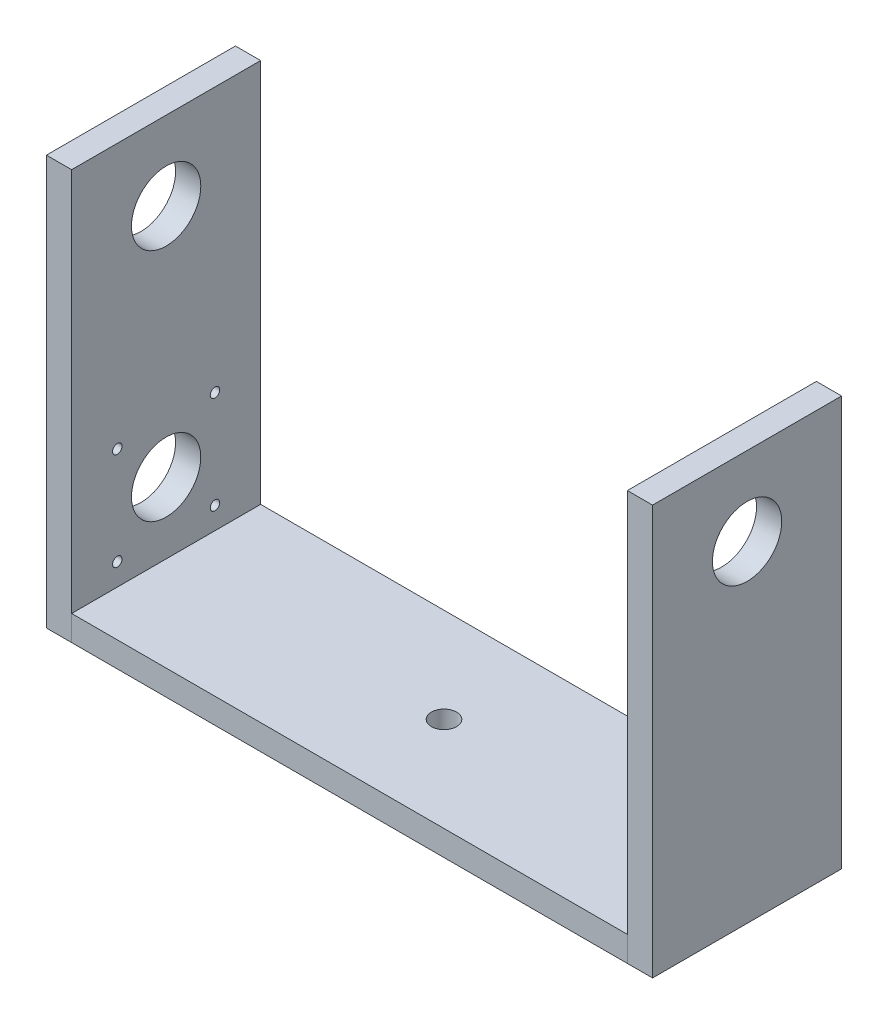
ISO-10303-21;
HEADER;
FILE_DESCRIPTION(('STEP AP214'),'2;1');
FILE_NAME('part.step','',(''),(''),'','','');
FILE_SCHEMA(('AUTOMOTIVE_DESIGN { 1 0 10303 214 1 1 1 1 }'));
ENDSEC;
DATA;
#1=APPLICATION_CONTEXT('core data for automotive mechanical design processes');
#2=APPLICATION_PROTOCOL_DEFINITION('international standard','automotive_design',2000,#1);
#3=PRODUCT_CONTEXT('',#1,'mechanical');
#4=PRODUCT('Part','Part','',(#3));
#5=PRODUCT_RELATED_PRODUCT_CATEGORY('part','',(#4));
#6=PRODUCT_DEFINITION_FORMATION('','',#4);
#7=PRODUCT_DEFINITION_CONTEXT('part definition',#1,'design');
#8=PRODUCT_DEFINITION('design','',#6,#7);
#9=PRODUCT_DEFINITION_SHAPE('','',#8);
#10=(LENGTH_UNIT() NAMED_UNIT(*) SI_UNIT(.MILLI.,.METRE.));
#11=(NAMED_UNIT(*) PLANE_ANGLE_UNIT() SI_UNIT($,.RADIAN.));
#12=(NAMED_UNIT(*) SI_UNIT($,.STERADIAN.) SOLID_ANGLE_UNIT());
#13=UNCERTAINTY_MEASURE_WITH_UNIT(LENGTH_MEASURE(1.E-05),#10,'distance_accuracy_value','');
#14=(GEOMETRIC_REPRESENTATION_CONTEXT(3) GLOBAL_UNCERTAINTY_ASSIGNED_CONTEXT((#13)) GLOBAL_UNIT_ASSIGNED_CONTEXT((#10,
#11,#12)) REPRESENTATION_CONTEXT('',''));
#15=CARTESIAN_POINT('',(0.,0.,0.));
#16=DIRECTION('',(0.,0.,1.));
#17=DIRECTION('',(1.,0.,0.));
#18=AXIS2_PLACEMENT_3D('',#15,#16,#17);
#19=CARTESIAN_POINT('',(-96.2,126.,60.));
#20=DIRECTION('',(0.,-1.,0.));
#21=DIRECTION('',(0.,0.,-1.));
#22=AXIS2_PLACEMENT_3D('',#19,#20,#21);
#23=PLANE('',#22);
#24=DIRECTION('',(0.,0.,-1.));
#25=VECTOR('',#24,1.);
#26=CARTESIAN_POINT('',(-88.2,126.,60.));
#27=LINE('',#26,#25);
#28=CARTESIAN_POINT('',(-88.2,126.,60.));
#29=VERTEX_POINT('',#28);
#30=CARTESIAN_POINT('',(-88.2,126.,0.));
#31=VERTEX_POINT('',#30);
#32=EDGE_CURVE('E109',#29,#31,#27,.T.);
#33=ORIENTED_EDGE('',*,*,#32,.T.);
#34=DIRECTION('',(1.,0.,0.));
#35=VECTOR('',#34,1.);
#36=CARTESIAN_POINT('',(-96.2,126.,0.));
#37=LINE('',#36,#35);
#38=CARTESIAN_POINT('',(-96.2,126.,0.));
#39=VERTEX_POINT('',#38);
#40=EDGE_CURVE('E12',#39,#31,#37,.T.);
#41=ORIENTED_EDGE('',*,*,#40,.F.);
#42=DIRECTION('',(0.,0.,-1.));
#43=VECTOR('',#42,1.);
#44=CARTESIAN_POINT('',(-96.2,126.,60.));
#45=LINE('',#44,#43);
#46=CARTESIAN_POINT('',(-96.2,126.,60.));
#47=VERTEX_POINT('',#46);
#48=EDGE_CURVE('E96',#47,#39,#45,.T.);
#49=ORIENTED_EDGE('',*,*,#48,.F.);
#50=DIRECTION('',(1.,0.,0.));
#51=VECTOR('',#50,1.);
#52=CARTESIAN_POINT('',(-96.2,126.,60.));
#53=LINE('',#52,#51);
#54=EDGE_CURVE('E105',#47,#29,#53,.T.);
#55=ORIENTED_EDGE('',*,*,#54,.T.);
#56=EDGE_LOOP('',(#33,#41,#49,#55));
#57=FACE_BOUND('',#56,.T.);
#58=ADVANCED_FACE('F44',(#57),#23,.F.);
#59=CARTESIAN_POINT('',(-96.2,126.,0.));
#60=DIRECTION('',(0.,0.,1.));
#61=DIRECTION('',(1.,0.,0.));
#62=AXIS2_PLACEMENT_3D('',#59,#60,#61);
#63=PLANE('',#62);
#64=DIRECTION('',(0.,-1.,0.));
#65=VECTOR('',#64,1.);
#66=CARTESIAN_POINT('',(-88.2,126.,0.));
#67=LINE('',#66,#65);
#68=CARTESIAN_POINT('',(-88.2,-4.,0.));
#69=VERTEX_POINT('',#68);
#70=EDGE_CURVE('E100',#31,#69,#67,.T.);
#71=ORIENTED_EDGE('',*,*,#70,.T.);
#72=DIRECTION('',(1.,0.,0.));
#73=VECTOR('',#72,1.);
#74=CARTESIAN_POINT('',(-96.2,-4.,0.));
#75=LINE('',#74,#73);
#76=CARTESIAN_POINT('',(-96.2,-4.,0.));
#77=VERTEX_POINT('',#76);
#78=EDGE_CURVE('E53',#77,#69,#75,.T.);
#79=ORIENTED_EDGE('',*,*,#78,.F.);
#80=DIRECTION('',(0.,-1.,0.));
#81=VECTOR('',#80,1.);
#82=CARTESIAN_POINT('',(-96.2,126.,0.));
#83=LINE('',#82,#81);
#84=EDGE_CURVE('E91',#39,#77,#83,.T.);
#85=ORIENTED_EDGE('',*,*,#84,.F.);
#86=ORIENTED_EDGE('',*,*,#40,.T.);
#87=EDGE_LOOP('',(#71,#79,#85,#86));
#88=FACE_BOUND('',#87,.T.);
#89=ADVANCED_FACE('F99',(#88),#63,.F.);
#90=CARTESIAN_POINT('',(-96.2,-4.,0.));
#91=DIRECTION('',(0.,1.,0.));
#92=DIRECTION('',(0.,0.,1.));
#93=AXIS2_PLACEMENT_3D('',#90,#91,#92);
#94=PLANE('',#93);
#95=DIRECTION('',(0.,0.,1.));
#96=VECTOR('',#95,1.);
#97=CARTESIAN_POINT('',(-88.2,-4.,0.));
#98=LINE('',#97,#96);
#99=CARTESIAN_POINT('',(-88.2,-4.,60.));
#100=VERTEX_POINT('',#99);
#101=EDGE_CURVE('E78',#69,#100,#98,.T.);
#102=ORIENTED_EDGE('',*,*,#101,.T.);
#103=DIRECTION('',(1.,0.,0.));
#104=VECTOR('',#103,1.);
#105=CARTESIAN_POINT('',(-96.2,-4.,60.));
#106=LINE('',#105,#104);
#107=CARTESIAN_POINT('',(-96.2,-4.,60.));
#108=VERTEX_POINT('',#107);
#109=EDGE_CURVE('E101',#108,#100,#106,.T.);
#110=ORIENTED_EDGE('',*,*,#109,.F.);
#111=DIRECTION('',(0.,0.,1.));
#112=VECTOR('',#111,1.);
#113=CARTESIAN_POINT('',(-96.2,-4.,0.));
#114=LINE('',#113,#112);
#115=EDGE_CURVE('E94',#77,#108,#114,.T.);
#116=ORIENTED_EDGE('',*,*,#115,.F.);
#117=ORIENTED_EDGE('',*,*,#78,.T.);
#118=EDGE_LOOP('',(#102,#110,#116,#117));
#119=FACE_BOUND('',#118,.T.);
#120=ADVANCED_FACE('F103',(#119),#94,.F.);
#121=CARTESIAN_POINT('',(-96.2,-4.,60.));
#122=DIRECTION('',(0.,0.,-1.));
#123=DIRECTION('',(-1.,0.,0.));
#124=AXIS2_PLACEMENT_3D('',#121,#122,#123);
#125=PLANE('',#124);
#126=DIRECTION('',(0.,1.,0.));
#127=VECTOR('',#126,1.);
#128=CARTESIAN_POINT('',(-88.2,-4.,60.));
#129=LINE('',#128,#127);
#130=EDGE_CURVE('E84',#100,#29,#129,.T.);
#131=ORIENTED_EDGE('',*,*,#130,.T.);
#132=ORIENTED_EDGE('',*,*,#54,.F.);
#133=DIRECTION('',(0.,1.,0.));
#134=VECTOR('',#133,1.);
#135=CARTESIAN_POINT('',(-96.2,-4.,60.));
#136=LINE('',#135,#134);
#137=EDGE_CURVE('E61',#108,#47,#136,.T.);
#138=ORIENTED_EDGE('',*,*,#137,.F.);
#139=ORIENTED_EDGE('',*,*,#109,.T.);
#140=EDGE_LOOP('',(#131,#132,#138,#139));
#141=FACE_BOUND('',#140,.T.);
#142=ADVANCED_FACE('F116',(#141),#125,.F.);
#143=CARTESIAN_POINT('',(-96.2,0.,0.));
#144=DIRECTION('',(-1.,0.,0.));
#145=DIRECTION('',(0.,0.,1.));
#146=AXIS2_PLACEMENT_3D('',#143,#144,#145);
#147=PLANE('',#146);
#148=CARTESIAN_POINT('',(-96.2,26.5,30.));
#149=DIRECTION('',(-1.,0.,0.));
#150=DIRECTION('',(0.,0.,1.));
#151=AXIS2_PLACEMENT_3D('',#148,#149,#150);
#152=CIRCLE('',#151,11.);
#153=CARTESIAN_POINT('',(-96.2,26.5,41.));
#154=VERTEX_POINT('',#153);
#155=EDGE_CURVE('E136',#154,#154,#152,.T.);
#156=ORIENTED_EDGE('',*,*,#155,.F.);
#157=EDGE_LOOP('',(#156));
#158=FACE_BOUND('',#157,.T.);
#159=CARTESIAN_POINT('',(-96.2,11.,14.5));
#160=DIRECTION('',(-1.,0.,0.));
#161=DIRECTION('',(0.,0.,1.));
#162=AXIS2_PLACEMENT_3D('',#159,#160,#161);
#163=CIRCLE('',#162,1.5);
#164=CARTESIAN_POINT('',(-96.2,11.,16.));
#165=VERTEX_POINT('',#164);
#166=EDGE_CURVE('E135',#165,#165,#163,.T.);
#167=ORIENTED_EDGE('',*,*,#166,.F.);
#168=EDGE_LOOP('',(#167));
#169=FACE_BOUND('',#168,.T.);
#170=CARTESIAN_POINT('',(-96.2,11.,45.5));
#171=DIRECTION('',(-1.,0.,0.));
#172=DIRECTION('',(0.,0.,1.));
#173=AXIS2_PLACEMENT_3D('',#170,#171,#172);
#174=CIRCLE('',#173,1.5);
#175=CARTESIAN_POINT('',(-96.2,11.,47.));
#176=VERTEX_POINT('',#175);
#177=EDGE_CURVE('E142',#176,#176,#174,.T.);
#178=ORIENTED_EDGE('',*,*,#177,.F.);
#179=EDGE_LOOP('',(#178));
#180=FACE_BOUND('',#179,.T.);
#181=CARTESIAN_POINT('',(-96.2,42.,45.5));
#182=DIRECTION('',(-1.,0.,0.));
#183=DIRECTION('',(0.,0.,1.));
#184=AXIS2_PLACEMENT_3D('',#181,#182,#183);
#185=CIRCLE('',#184,1.5);
#186=CARTESIAN_POINT('',(-96.2,42.,47.));
#187=VERTEX_POINT('',#186);
#188=EDGE_CURVE('E148',#187,#187,#185,.T.);
#189=ORIENTED_EDGE('',*,*,#188,.F.);
#190=EDGE_LOOP('',(#189));
#191=FACE_BOUND('',#190,.T.);
#192=CARTESIAN_POINT('',(-96.2,42.,14.5));
#193=DIRECTION('',(-1.,0.,0.));
#194=DIRECTION('',(0.,0.,1.));
#195=AXIS2_PLACEMENT_3D('',#192,#193,#194);
#196=CIRCLE('',#195,1.5);
#197=CARTESIAN_POINT('',(-96.2,42.,16.));
#198=VERTEX_POINT('',#197);
#199=EDGE_CURVE('E128',#198,#198,#196,.T.);
#200=ORIENTED_EDGE('',*,*,#199,.F.);
#201=EDGE_LOOP('',(#200));
#202=FACE_BOUND('',#201,.T.);
#203=CARTESIAN_POINT('',(-96.2,101.,30.));
#204=DIRECTION('',(1.,0.,0.));
#205=DIRECTION('',(0.,0.,-1.));
#206=AXIS2_PLACEMENT_3D('',#203,#204,#205);
#207=CIRCLE('',#206,11.);
#208=CARTESIAN_POINT('',(-96.2,101.,19.));
#209=VERTEX_POINT('',#208);
#210=EDGE_CURVE('E122',#209,#209,#207,.T.);
#211=ORIENTED_EDGE('',*,*,#210,.T.);
#212=EDGE_LOOP('',(#211));
#213=FACE_BOUND('',#212,.T.);
#214=ORIENTED_EDGE('',*,*,#48,.T.);
#215=ORIENTED_EDGE('',*,*,#84,.T.);
#216=ORIENTED_EDGE('',*,*,#115,.T.);
#217=ORIENTED_EDGE('',*,*,#137,.T.);
#218=EDGE_LOOP('',(#214,#215,#216,#217));
#219=FACE_BOUND('',#218,.T.);
#220=ADVANCED_FACE('F92',(#158,#169,#180,#191,#202,#213,#219),#147,.T.);
#221=CARTESIAN_POINT('',(-88.2,0.,0.));
#222=DIRECTION('',(-1.,0.,0.));
#223=DIRECTION('',(0.,0.,1.));
#224=AXIS2_PLACEMENT_3D('',#221,#222,#223);
#225=PLANE('',#224);
#226=CARTESIAN_POINT('',(-88.2,26.5,30.));
#227=DIRECTION('',(-1.,0.,0.));
#228=DIRECTION('',(0.,0.,1.));
#229=AXIS2_PLACEMENT_3D('',#226,#227,#228);
#230=CIRCLE('',#229,11.);
#231=CARTESIAN_POINT('',(-88.2,26.5,41.));
#232=VERTEX_POINT('',#231);
#233=EDGE_CURVE('E132',#232,#232,#230,.F.);
#234=ORIENTED_EDGE('',*,*,#233,.F.);
#235=EDGE_LOOP('',(#234));
#236=FACE_BOUND('',#235,.T.);
#237=CARTESIAN_POINT('',(-88.2,11.,14.5));
#238=DIRECTION('',(-1.,0.,0.));
#239=DIRECTION('',(0.,0.,1.));
#240=AXIS2_PLACEMENT_3D('',#237,#238,#239);
#241=CIRCLE('',#240,1.5);
#242=CARTESIAN_POINT('',(-88.2,11.,16.));
#243=VERTEX_POINT('',#242);
#244=EDGE_CURVE('E139',#243,#243,#241,.F.);
#245=ORIENTED_EDGE('',*,*,#244,.F.);
#246=EDGE_LOOP('',(#245));
#247=FACE_BOUND('',#246,.T.);
#248=CARTESIAN_POINT('',(-88.2,11.,45.5));
#249=DIRECTION('',(-1.,0.,0.));
#250=DIRECTION('',(0.,0.,1.));
#251=AXIS2_PLACEMENT_3D('',#248,#249,#250);
#252=CIRCLE('',#251,1.5);
#253=CARTESIAN_POINT('',(-88.2,11.,47.));
#254=VERTEX_POINT('',#253);
#255=EDGE_CURVE('E145',#254,#254,#252,.F.);
#256=ORIENTED_EDGE('',*,*,#255,.F.);
#257=EDGE_LOOP('',(#256));
#258=FACE_BOUND('',#257,.T.);
#259=CARTESIAN_POINT('',(-88.2,42.,45.5));
#260=DIRECTION('',(-1.,0.,0.));
#261=DIRECTION('',(0.,0.,1.));
#262=AXIS2_PLACEMENT_3D('',#259,#260,#261);
#263=CIRCLE('',#262,1.5);
#264=CARTESIAN_POINT('',(-88.2,42.,47.));
#265=VERTEX_POINT('',#264);
#266=EDGE_CURVE('E131',#265,#265,#263,.F.);
#267=ORIENTED_EDGE('',*,*,#266,.F.);
#268=EDGE_LOOP('',(#267));
#269=FACE_BOUND('',#268,.T.);
#270=CARTESIAN_POINT('',(-88.2,42.,14.5));
#271=DIRECTION('',(-1.,0.,0.));
#272=DIRECTION('',(0.,0.,1.));
#273=AXIS2_PLACEMENT_3D('',#270,#271,#272);
#274=CIRCLE('',#273,1.5);
#275=CARTESIAN_POINT('',(-88.2,42.,16.));
#276=VERTEX_POINT('',#275);
#277=EDGE_CURVE('E125',#276,#276,#274,.F.);
#278=ORIENTED_EDGE('',*,*,#277,.F.);
#279=EDGE_LOOP('',(#278));
#280=FACE_BOUND('',#279,.T.);
#281=CARTESIAN_POINT('',(-88.2,101.,30.));
#282=DIRECTION('',(-1.,0.,0.));
#283=DIRECTION('',(0.,0.,1.));
#284=AXIS2_PLACEMENT_3D('',#281,#282,#283);
#285=CIRCLE('',#284,11.);
#286=CARTESIAN_POINT('',(-88.2,101.,41.));
#287=VERTEX_POINT('',#286);
#288=EDGE_CURVE('E47',#287,#287,#285,.T.);
#289=ORIENTED_EDGE('',*,*,#288,.T.);
#290=EDGE_LOOP('',(#289));
#291=FACE_BOUND('',#290,.T.);
#292=ORIENTED_EDGE('',*,*,#32,.F.);
#293=ORIENTED_EDGE('',*,*,#130,.F.);
#294=ORIENTED_EDGE('',*,*,#101,.F.);
#295=ORIENTED_EDGE('',*,*,#70,.F.);
#296=EDGE_LOOP('',(#292,#293,#294,#295));
#297=FACE_BOUND('',#296,.T.);
#298=ADVANCED_FACE('F119',(#236,#247,#258,#269,#280,#291,#297),#225,.F.);
#299=CARTESIAN_POINT('',(-96.2,101.,30.));
#300=DIRECTION('',(1.,0.,0.));
#301=DIRECTION('',(0.,0.,-1.));
#302=AXIS2_PLACEMENT_3D('',#299,#300,#301);
#303=CYLINDRICAL_SURFACE('',#302,11.);
#304=ORIENTED_EDGE('',*,*,#210,.F.);
#305=EDGE_LOOP('',(#304));
#306=FACE_BOUND('',#305,.T.);
#307=ORIENTED_EDGE('',*,*,#288,.F.);
#308=EDGE_LOOP('',(#307));
#309=FACE_BOUND('',#308,.T.);
#310=ADVANCED_FACE('F167',(#306,#309),#303,.F.);
#311=CARTESIAN_POINT('',(96.201,42.,14.5));
#312=DIRECTION('',(-1.,0.,0.));
#313=DIRECTION('',(0.,0.,1.));
#314=AXIS2_PLACEMENT_3D('',#311,#312,#313);
#315=CYLINDRICAL_SURFACE('',#314,1.5);
#316=ORIENTED_EDGE('',*,*,#199,.T.);
#317=EDGE_LOOP('',(#316));
#318=FACE_BOUND('',#317,.T.);
#319=ORIENTED_EDGE('',*,*,#277,.T.);
#320=EDGE_LOOP('',(#319));
#321=FACE_BOUND('',#320,.T.);
#322=ADVANCED_FACE('F170',(#318,#321),#315,.F.);
#323=CARTESIAN_POINT('',(96.201,42.,45.5));
#324=DIRECTION('',(-1.,0.,0.));
#325=DIRECTION('',(0.,0.,1.));
#326=AXIS2_PLACEMENT_3D('',#323,#324,#325);
#327=CYLINDRICAL_SURFACE('',#326,1.5);
#328=ORIENTED_EDGE('',*,*,#188,.T.);
#329=EDGE_LOOP('',(#328));
#330=FACE_BOUND('',#329,.T.);
#331=ORIENTED_EDGE('',*,*,#266,.T.);
#332=EDGE_LOOP('',(#331));
#333=FACE_BOUND('',#332,.T.);
#334=ADVANCED_FACE('F156',(#330,#333),#327,.F.);
#335=CARTESIAN_POINT('',(96.201,11.,45.5));
#336=DIRECTION('',(-1.,0.,0.));
#337=DIRECTION('',(0.,0.,1.));
#338=AXIS2_PLACEMENT_3D('',#335,#336,#337);
#339=CYLINDRICAL_SURFACE('',#338,1.5);
#340=ORIENTED_EDGE('',*,*,#177,.T.);
#341=EDGE_LOOP('',(#340));
#342=FACE_BOUND('',#341,.T.);
#343=ORIENTED_EDGE('',*,*,#255,.T.);
#344=EDGE_LOOP('',(#343));
#345=FACE_BOUND('',#344,.T.);
#346=ADVANCED_FACE('F223',(#342,#345),#339,.F.);
#347=CARTESIAN_POINT('',(96.201,11.,14.5));
#348=DIRECTION('',(-1.,0.,0.));
#349=DIRECTION('',(0.,0.,1.));
#350=AXIS2_PLACEMENT_3D('',#347,#348,#349);
#351=CYLINDRICAL_SURFACE('',#350,1.5);
#352=ORIENTED_EDGE('',*,*,#166,.T.);
#353=EDGE_LOOP('',(#352));
#354=FACE_BOUND('',#353,.T.);
#355=ORIENTED_EDGE('',*,*,#244,.T.);
#356=EDGE_LOOP('',(#355));
#357=FACE_BOUND('',#356,.T.);
#358=ADVANCED_FACE('F230',(#354,#357),#351,.F.);
#359=CARTESIAN_POINT('',(96.201,26.5,30.));
#360=DIRECTION('',(-1.,0.,0.));
#361=DIRECTION('',(0.,0.,1.));
#362=AXIS2_PLACEMENT_3D('',#359,#360,#361);
#363=CYLINDRICAL_SURFACE('',#362,11.);
#364=ORIENTED_EDGE('',*,*,#155,.T.);
#365=EDGE_LOOP('',(#364));
#366=FACE_BOUND('',#365,.T.);
#367=ORIENTED_EDGE('',*,*,#233,.T.);
#368=EDGE_LOOP('',(#367));
#369=FACE_BOUND('',#368,.T.);
#370=ADVANCED_FACE('F238',(#366,#369),#363,.F.);
#371=CLOSED_SHELL('',(#58,#89,#120,#142,#220,#298,#310,#322,#334,#346,#358,#370));
#372=MANIFOLD_SOLID_BREP('B2',#371);
#373=CARTESIAN_POINT('',(96.2,-4.,60.));
#374=DIRECTION('',(0.,0.,-1.));
#375=DIRECTION('',(-1.,0.,0.));
#376=AXIS2_PLACEMENT_3D('',#373,#374,#375);
#377=PLANE('',#376);
#378=DIRECTION('',(0.,-1.,0.));
#379=VECTOR('',#378,1.);
#380=CARTESIAN_POINT('',(88.2,-4.,60.));
#381=LINE('',#380,#379);
#382=CARTESIAN_POINT('',(88.2,126.,60.));
#383=VERTEX_POINT('',#382);
#384=CARTESIAN_POINT('',(88.2,-4.,60.));
#385=VERTEX_POINT('',#384);
#386=EDGE_CURVE('E367',#383,#385,#381,.T.);
#387=ORIENTED_EDGE('',*,*,#386,.T.);
#388=DIRECTION('',(-1.,0.,0.));
#389=VECTOR('',#388,1.);
#390=CARTESIAN_POINT('',(96.2,-4.,60.));
#391=LINE('',#390,#389);
#392=CARTESIAN_POINT('',(96.2,-4.,60.));
#393=VERTEX_POINT('',#392);
#394=EDGE_CURVE('E42',#393,#385,#391,.T.);
#395=ORIENTED_EDGE('',*,*,#394,.F.);
#396=DIRECTION('',(0.,-1.,0.));
#397=VECTOR('',#396,1.);
#398=CARTESIAN_POINT('',(96.2,-4.,60.));
#399=LINE('',#398,#397);
#400=CARTESIAN_POINT('',(96.2,126.,60.));
#401=VERTEX_POINT('',#400);
#402=EDGE_CURVE('E354',#401,#393,#399,.T.);
#403=ORIENTED_EDGE('',*,*,#402,.F.);
#404=DIRECTION('',(-1.,0.,0.));
#405=VECTOR('',#404,1.);
#406=CARTESIAN_POINT('',(96.2,126.,60.));
#407=LINE('',#406,#405);
#408=EDGE_CURVE('E363',#401,#383,#407,.T.);
#409=ORIENTED_EDGE('',*,*,#408,.T.);
#410=EDGE_LOOP('',(#387,#395,#403,#409));
#411=FACE_BOUND('',#410,.T.);
#412=ADVANCED_FACE('F302',(#411),#377,.F.);
#413=CARTESIAN_POINT('',(96.2,-4.,60.));
#414=DIRECTION('',(0.,1.,0.));
#415=DIRECTION('',(0.,0.,1.));
#416=AXIS2_PLACEMENT_3D('',#413,#414,#415);
#417=PLANE('',#416);
#418=DIRECTION('',(0.,0.,-1.));
#419=VECTOR('',#418,1.);
#420=CARTESIAN_POINT('',(88.2,-4.,60.));
#421=LINE('',#420,#419);
#422=CARTESIAN_POINT('',(88.2,-4.,0.));
#423=VERTEX_POINT('',#422);
#424=EDGE_CURVE('E358',#385,#423,#421,.T.);
#425=ORIENTED_EDGE('',*,*,#424,.T.);
#426=DIRECTION('',(-1.,0.,0.));
#427=VECTOR('',#426,1.);
#428=CARTESIAN_POINT('',(96.2,-4.,0.));
#429=LINE('',#428,#427);
#430=CARTESIAN_POINT('',(96.2,-4.,0.));
#431=VERTEX_POINT('',#430);
#432=EDGE_CURVE('E311',#431,#423,#429,.T.);
#433=ORIENTED_EDGE('',*,*,#432,.F.);
#434=DIRECTION('',(0.,0.,-1.));
#435=VECTOR('',#434,1.);
#436=CARTESIAN_POINT('',(96.2,-4.,60.));
#437=LINE('',#436,#435);
#438=EDGE_CURVE('E349',#393,#431,#437,.T.);
#439=ORIENTED_EDGE('',*,*,#438,.F.);
#440=ORIENTED_EDGE('',*,*,#394,.T.);
#441=EDGE_LOOP('',(#425,#433,#439,#440));
#442=FACE_BOUND('',#441,.T.);
#443=ADVANCED_FACE('F357',(#442),#417,.F.);
#444=CARTESIAN_POINT('',(96.2,-4.,0.));
#445=DIRECTION('',(0.,0.,1.));
#446=DIRECTION('',(1.,0.,0.));
#447=AXIS2_PLACEMENT_3D('',#444,#445,#446);
#448=PLANE('',#447);
#449=DIRECTION('',(0.,1.,0.));
#450=VECTOR('',#449,1.);
#451=CARTESIAN_POINT('',(88.2,-4.,0.));
#452=LINE('',#451,#450);
#453=CARTESIAN_POINT('',(88.2,126.,0.));
#454=VERTEX_POINT('',#453);
#455=EDGE_CURVE('E336',#423,#454,#452,.T.);
#456=ORIENTED_EDGE('',*,*,#455,.T.);
#457=DIRECTION('',(-1.,0.,0.));
#458=VECTOR('',#457,1.);
#459=CARTESIAN_POINT('',(96.2,126.,0.));
#460=LINE('',#459,#458);
#461=CARTESIAN_POINT('',(96.2,126.,0.));
#462=VERTEX_POINT('',#461);
#463=EDGE_CURVE('E359',#462,#454,#460,.T.);
#464=ORIENTED_EDGE('',*,*,#463,.F.);
#465=DIRECTION('',(0.,1.,0.));
#466=VECTOR('',#465,1.);
#467=CARTESIAN_POINT('',(96.2,-4.,0.));
#468=LINE('',#467,#466);
#469=EDGE_CURVE('E352',#431,#462,#468,.T.);
#470=ORIENTED_EDGE('',*,*,#469,.F.);
#471=ORIENTED_EDGE('',*,*,#432,.T.);
#472=EDGE_LOOP('',(#456,#464,#470,#471));
#473=FACE_BOUND('',#472,.T.);
#474=ADVANCED_FACE('F361',(#473),#448,.F.);
#475=CARTESIAN_POINT('',(96.2,126.,60.));
#476=DIRECTION('',(0.,-1.,0.));
#477=DIRECTION('',(0.,0.,-1.));
#478=AXIS2_PLACEMENT_3D('',#475,#476,#477);
#479=PLANE('',#478);
#480=DIRECTION('',(0.,0.,1.));
#481=VECTOR('',#480,1.);
#482=CARTESIAN_POINT('',(88.2,126.,60.));
#483=LINE('',#482,#481);
#484=EDGE_CURVE('E342',#454,#383,#483,.T.);
#485=ORIENTED_EDGE('',*,*,#484,.T.);
#486=ORIENTED_EDGE('',*,*,#408,.F.);
#487=DIRECTION('',(0.,0.,1.));
#488=VECTOR('',#487,1.);
#489=CARTESIAN_POINT('',(96.2,126.,60.));
#490=LINE('',#489,#488);
#491=EDGE_CURVE('E319',#462,#401,#490,.T.);
#492=ORIENTED_EDGE('',*,*,#491,.F.);
#493=ORIENTED_EDGE('',*,*,#463,.T.);
#494=EDGE_LOOP('',(#485,#486,#492,#493));
#495=FACE_BOUND('',#494,.T.);
#496=ADVANCED_FACE('F374',(#495),#479,.F.);
#497=CARTESIAN_POINT('',(96.2,0.,0.));
#498=DIRECTION('',(-1.,0.,0.));
#499=DIRECTION('',(0.,0.,1.));
#500=AXIS2_PLACEMENT_3D('',#497,#498,#499);
#501=PLANE('',#500);
#502=CARTESIAN_POINT('',(96.2,101.,30.));
#503=DIRECTION('',(1.,0.,0.));
#504=DIRECTION('',(0.,0.,-1.));
#505=AXIS2_PLACEMENT_3D('',#502,#503,#504);
#506=CIRCLE('',#505,11.);
#507=CARTESIAN_POINT('',(96.2,101.,19.));
#508=VERTEX_POINT('',#507);
#509=EDGE_CURVE('E380',#508,#508,#506,.T.);
#510=ORIENTED_EDGE('',*,*,#509,.F.);
#511=EDGE_LOOP('',(#510));
#512=FACE_BOUND('',#511,.T.);
#513=ORIENTED_EDGE('',*,*,#402,.T.);
#514=ORIENTED_EDGE('',*,*,#438,.T.);
#515=ORIENTED_EDGE('',*,*,#469,.T.);
#516=ORIENTED_EDGE('',*,*,#491,.T.);
#517=EDGE_LOOP('',(#513,#514,#515,#516));
#518=FACE_BOUND('',#517,.T.);
#519=ADVANCED_FACE('F350',(#512,#518),#501,.F.);
#520=CARTESIAN_POINT('',(88.2,0.,0.));
#521=DIRECTION('',(-1.,0.,0.));
#522=DIRECTION('',(0.,0.,1.));
#523=AXIS2_PLACEMENT_3D('',#520,#521,#522);
#524=PLANE('',#523);
#525=CARTESIAN_POINT('',(88.2,101.,30.));
#526=DIRECTION('',(-1.,0.,0.));
#527=DIRECTION('',(0.,0.,1.));
#528=AXIS2_PLACEMENT_3D('',#525,#526,#527);
#529=CIRCLE('',#528,11.);
#530=CARTESIAN_POINT('',(88.2,101.,41.));
#531=VERTEX_POINT('',#530);
#532=EDGE_CURVE('E305',#531,#531,#529,.T.);
#533=ORIENTED_EDGE('',*,*,#532,.F.);
#534=EDGE_LOOP('',(#533));
#535=FACE_BOUND('',#534,.T.);
#536=ORIENTED_EDGE('',*,*,#386,.F.);
#537=ORIENTED_EDGE('',*,*,#484,.F.);
#538=ORIENTED_EDGE('',*,*,#455,.F.);
#539=ORIENTED_EDGE('',*,*,#424,.F.);
#540=EDGE_LOOP('',(#536,#537,#538,#539));
#541=FACE_BOUND('',#540,.T.);
#542=ADVANCED_FACE('F377',(#535,#541),#524,.T.);
#543=CARTESIAN_POINT('',(-96.2,101.,30.));
#544=DIRECTION('',(1.,0.,0.));
#545=DIRECTION('',(0.,0.,-1.));
#546=AXIS2_PLACEMENT_3D('',#543,#544,#545);
#547=CYLINDRICAL_SURFACE('',#546,11.);
#548=ORIENTED_EDGE('',*,*,#532,.T.);
#549=EDGE_LOOP('',(#548));
#550=FACE_BOUND('',#549,.T.);
#551=ORIENTED_EDGE('',*,*,#509,.T.);
#552=EDGE_LOOP('',(#551));
#553=FACE_BOUND('',#552,.T.);
#554=ADVANCED_FACE('F387',(#550,#553),#547,.F.);
#555=CLOSED_SHELL('',(#412,#443,#474,#496,#519,#542,#554));
#556=MANIFOLD_SOLID_BREP('B6',#555);
#557=CARTESIAN_POINT('',(88.2,-4.,60.));
#558=DIRECTION('',(-1.,0.,0.));
#559=DIRECTION('',(0.,0.,1.));
#560=AXIS2_PLACEMENT_3D('',#557,#558,#559);
#561=PLANE('',#560);
#562=DIRECTION('',(0.,1.,0.));
#563=VECTOR('',#562,1.);
#564=CARTESIAN_POINT('',(88.2,-4.,0.));
#565=LINE('',#564,#563);
#566=CARTESIAN_POINT('',(88.2,-4.,0.));
#567=VERTEX_POINT('',#566);
#568=CARTESIAN_POINT('',(88.2,4.,0.));
#569=VERTEX_POINT('',#568);
#570=EDGE_CURVE('E509',#567,#569,#565,.T.);
#571=ORIENTED_EDGE('',*,*,#570,.T.);
#572=DIRECTION('',(0.,0.,-1.));
#573=VECTOR('',#572,1.);
#574=CARTESIAN_POINT('',(88.2,4.,60.));
#575=LINE('',#574,#573);
#576=CARTESIAN_POINT('',(88.2,4.,60.));
#577=VERTEX_POINT('',#576);
#578=EDGE_CURVE('E300',#577,#569,#575,.T.);
#579=ORIENTED_EDGE('',*,*,#578,.F.);
#580=DIRECTION('',(0.,1.,0.));
#581=VECTOR('',#580,1.);
#582=CARTESIAN_POINT('',(88.2,-4.,60.));
#583=LINE('',#582,#581);
#584=CARTESIAN_POINT('',(88.2,-4.,60.));
#585=VERTEX_POINT('',#584);
#586=EDGE_CURVE('E497',#585,#577,#583,.T.);
#587=ORIENTED_EDGE('',*,*,#586,.F.);
#588=DIRECTION('',(0.,0.,-1.));
#589=VECTOR('',#588,1.);
#590=CARTESIAN_POINT('',(88.2,-4.,60.));
#591=LINE('',#590,#589);
#592=EDGE_CURVE('E505',#585,#567,#591,.T.);
#593=ORIENTED_EDGE('',*,*,#592,.T.);
#594=EDGE_LOOP('',(#571,#579,#587,#593));
#595=FACE_BOUND('',#594,.T.);
#596=ADVANCED_FACE('F446',(#595),#561,.F.);
#597=CARTESIAN_POINT('',(-88.2,4.,60.));
#598=DIRECTION('',(0.,-1.,0.));
#599=DIRECTION('',(0.,0.,-1.));
#600=AXIS2_PLACEMENT_3D('',#597,#598,#599);
#601=PLANE('',#600);
#602=CARTESIAN_POINT('',(0.,4.,30.));
#603=DIRECTION('',(0.,-1.,0.));
#604=DIRECTION('',(0.,0.,-1.));
#605=AXIS2_PLACEMENT_3D('',#602,#603,#604);
#606=CIRCLE('',#605,4.);
#607=CARTESIAN_POINT('',(0.,4.,26.));
#608=VERTEX_POINT('',#607);
#609=EDGE_CURVE('E512',#608,#608,#606,.F.);
#610=ORIENTED_EDGE('',*,*,#609,.F.);
#611=EDGE_LOOP('',(#610));
#612=FACE_BOUND('',#611,.T.);
#613=DIRECTION('',(-1.,0.,0.));
#614=VECTOR('',#613,1.);
#615=CARTESIAN_POINT('',(-88.2,4.,0.));
#616=LINE('',#615,#614);
#617=CARTESIAN_POINT('',(-88.2,4.,0.));
#618=VERTEX_POINT('',#617);
#619=EDGE_CURVE('E501',#569,#618,#616,.T.);
#620=ORIENTED_EDGE('',*,*,#619,.T.);
#621=DIRECTION('',(0.,0.,-1.));
#622=VECTOR('',#621,1.);
#623=CARTESIAN_POINT('',(-88.2,4.,60.));
#624=LINE('',#623,#622);
#625=CARTESIAN_POINT('',(-88.2,4.,60.));
#626=VERTEX_POINT('',#625);
#627=EDGE_CURVE('E454',#626,#618,#624,.T.);
#628=ORIENTED_EDGE('',*,*,#627,.F.);
#629=DIRECTION('',(-1.,0.,0.));
#630=VECTOR('',#629,1.);
#631=CARTESIAN_POINT('',(-88.2,4.,60.));
#632=LINE('',#631,#630);
#633=EDGE_CURVE('E492',#577,#626,#632,.T.);
#634=ORIENTED_EDGE('',*,*,#633,.F.);
#635=ORIENTED_EDGE('',*,*,#578,.T.);
#636=EDGE_LOOP('',(#620,#628,#634,#635));
#637=FACE_BOUND('',#636,.T.);
#638=ADVANCED_FACE('F500',(#612,#637),#601,.F.);
#639=CARTESIAN_POINT('',(-88.2,-4.,60.));
#640=DIRECTION('',(1.,0.,0.));
#641=DIRECTION('',(0.,0.,-1.));
#642=AXIS2_PLACEMENT_3D('',#639,#640,#641);
#643=PLANE('',#642);
#644=DIRECTION('',(0.,-1.,0.));
#645=VECTOR('',#644,1.);
#646=CARTESIAN_POINT('',(-88.2,-4.,0.));
#647=LINE('',#646,#645);
#648=CARTESIAN_POINT('',(-88.2,-4.,0.));
#649=VERTEX_POINT('',#648);
#650=EDGE_CURVE('E479',#618,#649,#647,.T.);
#651=ORIENTED_EDGE('',*,*,#650,.T.);
#652=DIRECTION('',(0.,0.,-1.));
#653=VECTOR('',#652,1.);
#654=CARTESIAN_POINT('',(-88.2,-4.,60.));
#655=LINE('',#654,#653);
#656=CARTESIAN_POINT('',(-88.2,-4.,60.));
#657=VERTEX_POINT('',#656);
#658=EDGE_CURVE('E502',#657,#649,#655,.T.);
#659=ORIENTED_EDGE('',*,*,#658,.F.);
#660=DIRECTION('',(0.,-1.,0.));
#661=VECTOR('',#660,1.);
#662=CARTESIAN_POINT('',(-88.2,-4.,60.));
#663=LINE('',#662,#661);
#664=EDGE_CURVE('E495',#626,#657,#663,.T.);
#665=ORIENTED_EDGE('',*,*,#664,.F.);
#666=ORIENTED_EDGE('',*,*,#627,.T.);
#667=EDGE_LOOP('',(#651,#659,#665,#666));
#668=FACE_BOUND('',#667,.T.);
#669=ADVANCED_FACE('F503',(#668),#643,.F.);
#670=CARTESIAN_POINT('',(-88.2,-4.,60.));
#671=DIRECTION('',(0.,1.,0.));
#672=DIRECTION('',(0.,0.,1.));
#673=AXIS2_PLACEMENT_3D('',#670,#671,#672);
#674=PLANE('',#673);
#675=CARTESIAN_POINT('',(0.,-4.,30.));
#676=DIRECTION('',(0.,-1.,0.));
#677=DIRECTION('',(0.,0.,-1.));
#678=AXIS2_PLACEMENT_3D('',#675,#676,#677);
#679=CIRCLE('',#678,4.);
#680=CARTESIAN_POINT('',(0.,-4.,26.));
#681=VERTEX_POINT('',#680);
#682=EDGE_CURVE('E525',#681,#681,#679,.T.);
#683=ORIENTED_EDGE('',*,*,#682,.F.);
#684=EDGE_LOOP('',(#683));
#685=FACE_BOUND('',#684,.T.);
#686=DIRECTION('',(1.,0.,0.));
#687=VECTOR('',#686,1.);
#688=CARTESIAN_POINT('',(-88.2,-4.,0.));
#689=LINE('',#688,#687);
#690=EDGE_CURVE('E485',#649,#567,#689,.T.);
#691=ORIENTED_EDGE('',*,*,#690,.T.);
#692=ORIENTED_EDGE('',*,*,#592,.F.);
#693=DIRECTION('',(1.,0.,0.));
#694=VECTOR('',#693,1.);
#695=CARTESIAN_POINT('',(-88.2,-4.,60.));
#696=LINE('',#695,#694);
#697=EDGE_CURVE('E462',#657,#585,#696,.T.);
#698=ORIENTED_EDGE('',*,*,#697,.F.);
#699=ORIENTED_EDGE('',*,*,#658,.T.);
#700=EDGE_LOOP('',(#691,#692,#698,#699));
#701=FACE_BOUND('',#700,.T.);
#702=ADVANCED_FACE('F517',(#685,#701),#674,.F.);
#703=CARTESIAN_POINT('',(0.,0.,60.));
#704=DIRECTION('',(0.,0.,-1.));
#705=DIRECTION('',(-1.,0.,0.));
#706=AXIS2_PLACEMENT_3D('',#703,#704,#705);
#707=PLANE('',#706);
#708=ORIENTED_EDGE('',*,*,#586,.T.);
#709=ORIENTED_EDGE('',*,*,#633,.T.);
#710=ORIENTED_EDGE('',*,*,#664,.T.);
#711=ORIENTED_EDGE('',*,*,#697,.T.);
#712=EDGE_LOOP('',(#708,#709,#710,#711));
#713=FACE_BOUND('',#712,.T.);
#714=ADVANCED_FACE('F493',(#713),#707,.F.);
#715=CARTESIAN_POINT('',(0.,0.,0.));
#716=DIRECTION('',(0.,0.,-1.));
#717=DIRECTION('',(-1.,0.,0.));
#718=AXIS2_PLACEMENT_3D('',#715,#716,#717);
#719=PLANE('',#718);
#720=ORIENTED_EDGE('',*,*,#570,.F.);
#721=ORIENTED_EDGE('',*,*,#690,.F.);
#722=ORIENTED_EDGE('',*,*,#650,.F.);
#723=ORIENTED_EDGE('',*,*,#619,.F.);
#724=EDGE_LOOP('',(#720,#721,#722,#723));
#725=FACE_BOUND('',#724,.T.);
#726=ADVANCED_FACE('F520',(#725),#719,.T.);
#727=CARTESIAN_POINT('',(0.,126.001,30.));
#728=DIRECTION('',(0.,-1.,0.));
#729=DIRECTION('',(0.,0.,-1.));
#730=AXIS2_PLACEMENT_3D('',#727,#728,#729);
#731=CYLINDRICAL_SURFACE('',#730,4.);
#732=ORIENTED_EDGE('',*,*,#682,.T.);
#733=EDGE_LOOP('',(#732));
#734=FACE_BOUND('',#733,.T.);
#735=ORIENTED_EDGE('',*,*,#609,.T.);
#736=EDGE_LOOP('',(#735));
#737=FACE_BOUND('',#736,.T.);
#738=ADVANCED_FACE('F529',(#734,#737),#731,.F.);
#739=CLOSED_SHELL('',(#596,#638,#669,#702,#714,#726,#738));
#740=MANIFOLD_SOLID_BREP('B36',#739);
#741=ADVANCED_BREP_SHAPE_REPRESENTATION('',(#18,#372,#556,#740),#14);
#742=SHAPE_DEFINITION_REPRESENTATION(#9,#741);
ENDSEC;
END-ISO-10303-21;
